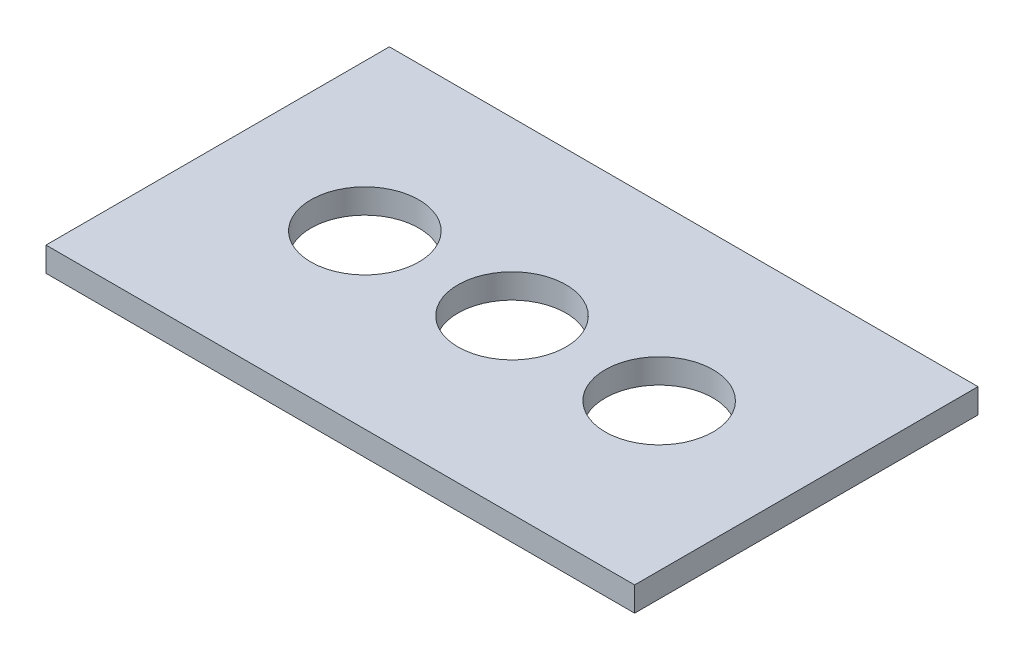
ISO-10303-21;
HEADER;
FILE_DESCRIPTION(('STEP AP214'),'2;1');
FILE_NAME('part.step','',(''),(''),'','','');
FILE_SCHEMA(('AUTOMOTIVE_DESIGN { 1 0 10303 214 1 1 1 1 }'));
ENDSEC;
DATA;
#1=APPLICATION_CONTEXT('core data for automotive mechanical design processes');
#2=APPLICATION_PROTOCOL_DEFINITION('international standard','automotive_design',2000,#1);
#3=PRODUCT_CONTEXT('',#1,'mechanical');
#4=PRODUCT('Part','Part','',(#3));
#5=PRODUCT_RELATED_PRODUCT_CATEGORY('part','',(#4));
#6=PRODUCT_DEFINITION_FORMATION('','',#4);
#7=PRODUCT_DEFINITION_CONTEXT('part definition',#1,'design');
#8=PRODUCT_DEFINITION('design','',#6,#7);
#9=PRODUCT_DEFINITION_SHAPE('','',#8);
#10=(LENGTH_UNIT() NAMED_UNIT(*) SI_UNIT(.MILLI.,.METRE.));
#11=(NAMED_UNIT(*) PLANE_ANGLE_UNIT() SI_UNIT($,.RADIAN.));
#12=(NAMED_UNIT(*) SI_UNIT($,.STERADIAN.) SOLID_ANGLE_UNIT());
#13=UNCERTAINTY_MEASURE_WITH_UNIT(LENGTH_MEASURE(1.E-05),#10,'distance_accuracy_value','');
#14=(GEOMETRIC_REPRESENTATION_CONTEXT(3) GLOBAL_UNCERTAINTY_ASSIGNED_CONTEXT((#13)) GLOBAL_UNIT_ASSIGNED_CONTEXT((#10,
#11,#12)) REPRESENTATION_CONTEXT('',''));
#15=CARTESIAN_POINT('',(0.,0.,0.));
#16=DIRECTION('',(0.,0.,1.));
#17=DIRECTION('',(1.,0.,0.));
#18=AXIS2_PLACEMENT_3D('',#15,#16,#17);
#19=CARTESIAN_POINT('',(0.,5.,0.));
#20=DIRECTION('',(1.,0.,0.));
#21=DIRECTION('',(0.,0.,-1.));
#22=AXIS2_PLACEMENT_3D('',#19,#20,#21);
#23=PLANE('',#22);
#24=DIRECTION('',(0.,0.,1.));
#25=VECTOR('',#24,1.);
#26=CARTESIAN_POINT('',(0.,0.,0.));
#27=LINE('',#26,#25);
#28=CARTESIAN_POINT('',(0.,0.,0.));
#29=VERTEX_POINT('',#28);
#30=CARTESIAN_POINT('',(0.,0.,70.));
#31=VERTEX_POINT('',#30);
#32=EDGE_CURVE('E107',#29,#31,#27,.T.);
#33=ORIENTED_EDGE('',*,*,#32,.T.);
#34=DIRECTION('',(0.,-1.,0.));
#35=VECTOR('',#34,1.);
#36=CARTESIAN_POINT('',(0.,5.,70.));
#37=LINE('',#36,#35);
#38=CARTESIAN_POINT('',(0.,5.,70.));
#39=VERTEX_POINT('',#38);
#40=EDGE_CURVE('E11',#39,#31,#37,.T.);
#41=ORIENTED_EDGE('',*,*,#40,.F.);
#42=DIRECTION('',(0.,0.,1.));
#43=VECTOR('',#42,1.);
#44=CARTESIAN_POINT('',(0.,5.,0.));
#45=LINE('',#44,#43);
#46=CARTESIAN_POINT('',(0.,5.,0.));
#47=VERTEX_POINT('',#46);
#48=EDGE_CURVE('E91',#47,#39,#45,.T.);
#49=ORIENTED_EDGE('',*,*,#48,.F.);
#50=DIRECTION('',(0.,-1.,0.));
#51=VECTOR('',#50,1.);
#52=CARTESIAN_POINT('',(0.,5.,0.));
#53=LINE('',#52,#51);
#54=EDGE_CURVE('E103',#47,#29,#53,.T.);
#55=ORIENTED_EDGE('',*,*,#54,.T.);
#56=EDGE_LOOP('',(#33,#41,#49,#55));
#57=FACE_BOUND('',#56,.T.);
#58=ADVANCED_FACE('F39',(#57),#23,.F.);
#59=CARTESIAN_POINT('',(0.,5.,70.));
#60=DIRECTION('',(0.,0.,-1.));
#61=DIRECTION('',(-1.,0.,0.));
#62=AXIS2_PLACEMENT_3D('',#59,#60,#61);
#63=PLANE('',#62);
#64=DIRECTION('',(1.,0.,0.));
#65=VECTOR('',#64,1.);
#66=CARTESIAN_POINT('',(0.,0.,70.));
#67=LINE('',#66,#65);
#68=CARTESIAN_POINT('',(120.,0.,70.));
#69=VERTEX_POINT('',#68);
#70=EDGE_CURVE('E96',#31,#69,#67,.T.);
#71=ORIENTED_EDGE('',*,*,#70,.T.);
#72=DIRECTION('',(0.,-1.,0.));
#73=VECTOR('',#72,1.);
#74=CARTESIAN_POINT('',(120.,5.,70.));
#75=LINE('',#74,#73);
#76=CARTESIAN_POINT('',(120.,5.,70.));
#77=VERTEX_POINT('',#76);
#78=EDGE_CURVE('E48',#77,#69,#75,.T.);
#79=ORIENTED_EDGE('',*,*,#78,.F.);
#80=DIRECTION('',(1.,0.,0.));
#81=VECTOR('',#80,1.);
#82=CARTESIAN_POINT('',(0.,5.,70.));
#83=LINE('',#82,#81);
#84=EDGE_CURVE('E86',#39,#77,#83,.T.);
#85=ORIENTED_EDGE('',*,*,#84,.F.);
#86=ORIENTED_EDGE('',*,*,#40,.T.);
#87=EDGE_LOOP('',(#71,#79,#85,#86));
#88=FACE_BOUND('',#87,.T.);
#89=ADVANCED_FACE('F95',(#88),#63,.F.);
#90=CARTESIAN_POINT('',(120.,5.,0.));
#91=DIRECTION('',(-1.,0.,0.));
#92=DIRECTION('',(0.,0.,1.));
#93=AXIS2_PLACEMENT_3D('',#90,#91,#92);
#94=PLANE('',#93);
#95=DIRECTION('',(0.,0.,-1.));
#96=VECTOR('',#95,1.);
#97=CARTESIAN_POINT('',(120.,0.,0.));
#98=LINE('',#97,#96);
#99=CARTESIAN_POINT('',(120.,0.,0.));
#100=VERTEX_POINT('',#99);
#101=EDGE_CURVE('E73',#69,#100,#98,.T.);
#102=ORIENTED_EDGE('',*,*,#101,.T.);
#103=DIRECTION('',(0.,-1.,0.));
#104=VECTOR('',#103,1.);
#105=CARTESIAN_POINT('',(120.,5.,0.));
#106=LINE('',#105,#104);
#107=CARTESIAN_POINT('',(120.,5.,0.));
#108=VERTEX_POINT('',#107);
#109=EDGE_CURVE('E98',#108,#100,#106,.T.);
#110=ORIENTED_EDGE('',*,*,#109,.F.);
#111=DIRECTION('',(0.,0.,-1.));
#112=VECTOR('',#111,1.);
#113=CARTESIAN_POINT('',(120.,5.,0.));
#114=LINE('',#113,#112);
#115=EDGE_CURVE('E89',#77,#108,#114,.T.);
#116=ORIENTED_EDGE('',*,*,#115,.F.);
#117=ORIENTED_EDGE('',*,*,#78,.T.);
#118=EDGE_LOOP('',(#102,#110,#116,#117));
#119=FACE_BOUND('',#118,.T.);
#120=ADVANCED_FACE('F99',(#119),#94,.F.);
#121=CARTESIAN_POINT('',(0.,5.,0.));
#122=DIRECTION('',(0.,0.,1.));
#123=DIRECTION('',(1.,0.,0.));
#124=AXIS2_PLACEMENT_3D('',#121,#122,#123);
#125=PLANE('',#124);
#126=DIRECTION('',(-1.,0.,0.));
#127=VECTOR('',#126,1.);
#128=CARTESIAN_POINT('',(0.,0.,0.));
#129=LINE('',#128,#127);
#130=EDGE_CURVE('E79',#100,#29,#129,.T.);
#131=ORIENTED_EDGE('',*,*,#130,.T.);
#132=ORIENTED_EDGE('',*,*,#54,.F.);
#133=DIRECTION('',(-1.,0.,0.));
#134=VECTOR('',#133,1.);
#135=CARTESIAN_POINT('',(0.,5.,0.));
#136=LINE('',#135,#134);
#137=EDGE_CURVE('E56',#108,#47,#136,.T.);
#138=ORIENTED_EDGE('',*,*,#137,.F.);
#139=ORIENTED_EDGE('',*,*,#109,.T.);
#140=EDGE_LOOP('',(#131,#132,#138,#139));
#141=FACE_BOUND('',#140,.T.);
#142=ADVANCED_FACE('F121',(#141),#125,.F.);
#143=CARTESIAN_POINT('',(0.,5.,0.));
#144=DIRECTION('',(0.,1.,0.));
#145=DIRECTION('',(0.,0.,1.));
#146=AXIS2_PLACEMENT_3D('',#143,#144,#145);
#147=PLANE('',#146);
#148=CARTESIAN_POINT('',(30.,5.,35.));
#149=DIRECTION('',(0.,1.,0.));
#150=DIRECTION('',(0.,0.,1.));
#151=AXIS2_PLACEMENT_3D('',#148,#149,#150);
#152=CIRCLE('',#151,11.);
#153=CARTESIAN_POINT('',(30.,5.,46.));
#154=VERTEX_POINT('',#153);
#155=EDGE_CURVE('E144',#154,#154,#152,.T.);
#156=ORIENTED_EDGE('',*,*,#155,.F.);
#157=EDGE_LOOP('',(#156));
#158=FACE_BOUND('',#157,.T.);
#159=CARTESIAN_POINT('',(60.,5.,35.));
#160=DIRECTION('',(0.,1.,0.));
#161=DIRECTION('',(0.,0.,1.));
#162=AXIS2_PLACEMENT_3D('',#159,#160,#161);
#163=CIRCLE('',#162,11.);
#164=CARTESIAN_POINT('',(60.,5.,46.));
#165=VERTEX_POINT('',#164);
#166=EDGE_CURVE('E136',#165,#165,#163,.T.);
#167=ORIENTED_EDGE('',*,*,#166,.F.);
#168=EDGE_LOOP('',(#167));
#169=FACE_BOUND('',#168,.T.);
#170=CARTESIAN_POINT('',(90.,5.,35.));
#171=DIRECTION('',(0.,1.,0.));
#172=DIRECTION('',(0.,0.,1.));
#173=AXIS2_PLACEMENT_3D('',#170,#171,#172);
#174=CIRCLE('',#173,11.);
#175=CARTESIAN_POINT('',(90.,5.,46.));
#176=VERTEX_POINT('',#175);
#177=EDGE_CURVE('E128',#176,#176,#174,.T.);
#178=ORIENTED_EDGE('',*,*,#177,.F.);
#179=EDGE_LOOP('',(#178));
#180=FACE_BOUND('',#179,.T.);
#181=ORIENTED_EDGE('',*,*,#48,.T.);
#182=ORIENTED_EDGE('',*,*,#84,.T.);
#183=ORIENTED_EDGE('',*,*,#115,.T.);
#184=ORIENTED_EDGE('',*,*,#137,.T.);
#185=EDGE_LOOP('',(#181,#182,#183,#184));
#186=FACE_BOUND('',#185,.T.);
#187=ADVANCED_FACE('F87',(#158,#169,#180,#186),#147,.T.);
#188=CARTESIAN_POINT('',(0.,0.,0.));
#189=DIRECTION('',(0.,1.,0.));
#190=DIRECTION('',(0.,0.,1.));
#191=AXIS2_PLACEMENT_3D('',#188,#189,#190);
#192=PLANE('',#191);
#193=CARTESIAN_POINT('',(30.,0.,35.));
#194=DIRECTION('',(0.,1.,0.));
#195=DIRECTION('',(0.,0.,1.));
#196=AXIS2_PLACEMENT_3D('',#193,#194,#195);
#197=CIRCLE('',#196,11.);
#198=CARTESIAN_POINT('',(30.,0.,46.));
#199=VERTEX_POINT('',#198);
#200=EDGE_CURVE('E111',#199,#199,#197,.T.);
#201=ORIENTED_EDGE('',*,*,#200,.T.);
#202=EDGE_LOOP('',(#201));
#203=FACE_BOUND('',#202,.T.);
#204=CARTESIAN_POINT('',(60.,0.,35.));
#205=DIRECTION('',(0.,1.,0.));
#206=DIRECTION('',(0.,0.,1.));
#207=AXIS2_PLACEMENT_3D('',#204,#205,#206);
#208=CIRCLE('',#207,11.);
#209=CARTESIAN_POINT('',(60.,0.,46.));
#210=VERTEX_POINT('',#209);
#211=EDGE_CURVE('E140',#210,#210,#208,.T.);
#212=ORIENTED_EDGE('',*,*,#211,.T.);
#213=EDGE_LOOP('',(#212));
#214=FACE_BOUND('',#213,.T.);
#215=CARTESIAN_POINT('',(90.,0.,35.));
#216=DIRECTION('',(0.,1.,0.));
#217=DIRECTION('',(0.,0.,1.));
#218=AXIS2_PLACEMENT_3D('',#215,#216,#217);
#219=CIRCLE('',#218,11.);
#220=CARTESIAN_POINT('',(90.,0.,46.));
#221=VERTEX_POINT('',#220);
#222=EDGE_CURVE('E132',#221,#221,#219,.T.);
#223=ORIENTED_EDGE('',*,*,#222,.T.);
#224=EDGE_LOOP('',(#223));
#225=FACE_BOUND('',#224,.T.);
#226=ORIENTED_EDGE('',*,*,#32,.F.);
#227=ORIENTED_EDGE('',*,*,#130,.F.);
#228=ORIENTED_EDGE('',*,*,#101,.F.);
#229=ORIENTED_EDGE('',*,*,#70,.F.);
#230=EDGE_LOOP('',(#226,#227,#228,#229));
#231=FACE_BOUND('',#230,.T.);
#232=ADVANCED_FACE('F124',(#203,#214,#225,#231),#192,.F.);
#233=CARTESIAN_POINT('',(90.,0.,35.));
#234=DIRECTION('',(0.,1.,0.));
#235=DIRECTION('',(0.,0.,1.));
#236=AXIS2_PLACEMENT_3D('',#233,#234,#235);
#237=CYLINDRICAL_SURFACE('',#236,11.);
#238=ORIENTED_EDGE('',*,*,#222,.F.);
#239=EDGE_LOOP('',(#238));
#240=FACE_BOUND('',#239,.T.);
#241=ORIENTED_EDGE('',*,*,#177,.T.);
#242=EDGE_LOOP('',(#241));
#243=FACE_BOUND('',#242,.T.);
#244=ADVANCED_FACE('F168',(#240,#243),#237,.F.);
#245=CARTESIAN_POINT('',(60.,0.,35.));
#246=DIRECTION('',(0.,1.,0.));
#247=DIRECTION('',(0.,0.,1.));
#248=AXIS2_PLACEMENT_3D('',#245,#246,#247);
#249=CYLINDRICAL_SURFACE('',#248,11.);
#250=ORIENTED_EDGE('',*,*,#211,.F.);
#251=EDGE_LOOP('',(#250));
#252=FACE_BOUND('',#251,.T.);
#253=ORIENTED_EDGE('',*,*,#166,.T.);
#254=EDGE_LOOP('',(#253));
#255=FACE_BOUND('',#254,.T.);
#256=ADVANCED_FACE('F157',(#252,#255),#249,.F.);
#257=CARTESIAN_POINT('',(30.,0.,35.));
#258=DIRECTION('',(0.,1.,0.));
#259=DIRECTION('',(0.,0.,1.));
#260=AXIS2_PLACEMENT_3D('',#257,#258,#259);
#261=CYLINDRICAL_SURFACE('',#260,11.);
#262=ORIENTED_EDGE('',*,*,#200,.F.);
#263=EDGE_LOOP('',(#262));
#264=FACE_BOUND('',#263,.T.);
#265=ORIENTED_EDGE('',*,*,#155,.T.);
#266=EDGE_LOOP('',(#265));
#267=FACE_BOUND('',#266,.T.);
#268=ADVANCED_FACE('F154',(#264,#267),#261,.F.);
#269=CLOSED_SHELL('',(#58,#89,#120,#142,#187,#232,#244,#256,#268));
#270=MANIFOLD_SOLID_BREP('B2',#269);
#271=ADVANCED_BREP_SHAPE_REPRESENTATION('',(#18,#270),#14);
#272=SHAPE_DEFINITION_REPRESENTATION(#9,#271);
ENDSEC;
END-ISO-10303-21;
